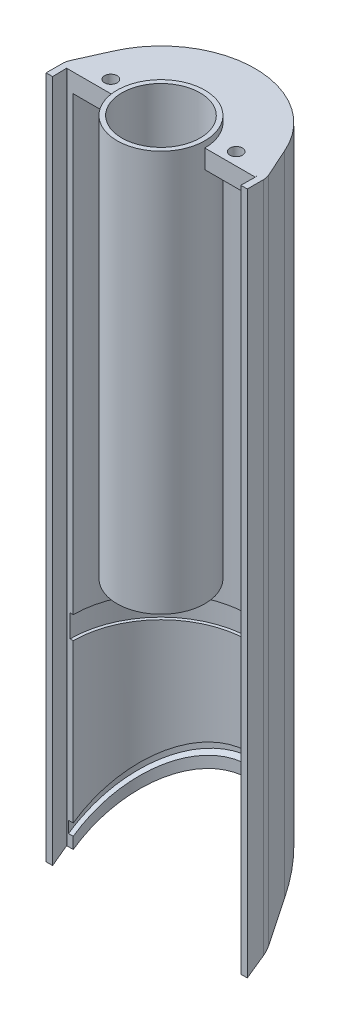
ISO-10303-21;
HEADER;
FILE_DESCRIPTION(('STEP AP214'),'2;1');
FILE_NAME('part.step','',(''),(''),'','','');
FILE_SCHEMA(('AUTOMOTIVE_DESIGN { 1 0 10303 214 1 1 1 1 }'));
ENDSEC;
DATA;
#1=APPLICATION_CONTEXT('core data for automotive mechanical design processes');
#2=APPLICATION_PROTOCOL_DEFINITION('international standard','automotive_design',2000,#1);
#3=PRODUCT_CONTEXT('',#1,'mechanical');
#4=PRODUCT('Part','Part','',(#3));
#5=PRODUCT_RELATED_PRODUCT_CATEGORY('part','',(#4));
#6=PRODUCT_DEFINITION_FORMATION('','',#4);
#7=PRODUCT_DEFINITION_CONTEXT('part definition',#1,'design');
#8=PRODUCT_DEFINITION('design','',#6,#7);
#9=PRODUCT_DEFINITION_SHAPE('','',#8);
#10=(LENGTH_UNIT() NAMED_UNIT(*) SI_UNIT(.MILLI.,.METRE.));
#11=(NAMED_UNIT(*) PLANE_ANGLE_UNIT() SI_UNIT($,.RADIAN.));
#12=(NAMED_UNIT(*) SI_UNIT($,.STERADIAN.) SOLID_ANGLE_UNIT());
#13=UNCERTAINTY_MEASURE_WITH_UNIT(LENGTH_MEASURE(1.E-05),#10,'distance_accuracy_value','');
#14=(GEOMETRIC_REPRESENTATION_CONTEXT(3) GLOBAL_UNCERTAINTY_ASSIGNED_CONTEXT((#13)) GLOBAL_UNIT_ASSIGNED_CONTEXT((#10,
#11,#12)) REPRESENTATION_CONTEXT('',''));
#15=CARTESIAN_POINT('',(0.,0.,0.));
#16=DIRECTION('',(0.,0.,1.));
#17=DIRECTION('',(1.,0.,0.));
#18=AXIS2_PLACEMENT_3D('',#15,#16,#17);
#19=CARTESIAN_POINT('',(49.6684249274681,0.,1.73416378763986E-13));
#20=DIRECTION('',(0.,0.,-1.));
#21=DIRECTION('',(-1.,0.,0.));
#22=AXIS2_PLACEMENT_3D('',#19,#20,#21);
#23=PLANE('',#22);
#24=DIRECTION('',(0.,-1.,0.));
#25=VECTOR('',#24,1.);
#26=CARTESIAN_POINT('',(38.8342124637338,0.,0.));
#27=LINE('',#26,#25);
#28=CARTESIAN_POINT('',(38.834212463734,285.422143483602,0.));
#29=VERTEX_POINT('',#28);
#30=CARTESIAN_POINT('',(38.834212463734,279.422143483602,0.));
#31=VERTEX_POINT('',#30);
#32=EDGE_CURVE('E251',#29,#31,#27,.T.);
#33=ORIENTED_EDGE('',*,*,#32,.T.);
#34=DIRECTION('',(-1.,0.,0.));
#35=VECTOR('',#34,1.);
#36=CARTESIAN_POINT('',(49.6684249274681,279.422143483602,1.73416378763986E-13));
#37=LINE('',#36,#35);
#38=CARTESIAN_POINT('',(52.834212463734,279.422143483602,1.95522954975215E-13));
#39=VERTEX_POINT('',#38);
#40=EDGE_CURVE('E443',#39,#31,#37,.T.);
#41=ORIENTED_EDGE('',*,*,#40,.F.);
#42=DIRECTION('',(0.,1.,0.));
#43=VECTOR('',#42,1.);
#44=CARTESIAN_POINT('',(52.834212463734,0.,1.95522954975215E-13));
#45=LINE('',#44,#43);
#46=CARTESIAN_POINT('',(52.834212463734,135.422143483602,1.95522954975215E-13));
#47=VERTEX_POINT('',#46);
#48=EDGE_CURVE('E439',#47,#39,#45,.T.);
#49=ORIENTED_EDGE('',*,*,#48,.F.);
#50=DIRECTION('',(-1.,0.,0.));
#51=VECTOR('',#50,1.);
#52=CARTESIAN_POINT('',(49.6684249274681,135.422143483602,1.73416378763986E-13));
#53=LINE('',#52,#51);
#54=CARTESIAN_POINT('',(53.834212463734,135.422143483602,2.02505917652902E-13));
#55=VERTEX_POINT('',#54);
#56=EDGE_CURVE('E435',#55,#47,#53,.T.);
#57=ORIENTED_EDGE('',*,*,#56,.F.);
#58=DIRECTION('',(0.,1.,0.));
#59=VECTOR('',#58,1.);
#60=CARTESIAN_POINT('',(53.834212463734,0.,2.02505917652902E-13));
#61=LINE('',#60,#59);
#62=CARTESIAN_POINT('',(53.834212463734,128.22799807346,2.02505917652902E-13));
#63=VERTEX_POINT('',#62);
#64=EDGE_CURVE('E431',#63,#55,#61,.T.);
#65=ORIENTED_EDGE('',*,*,#64,.F.);
#66=DIRECTION('',(1.,0.,0.));
#67=VECTOR('',#66,1.);
#68=CARTESIAN_POINT('',(49.6684249274681,128.22799807346,1.73416378763986E-13));
#69=LINE('',#68,#67);
#70=CARTESIAN_POINT('',(52.834212463734,128.22799807346,1.95522954975215E-13));
#71=VERTEX_POINT('',#70);
#72=EDGE_CURVE('E456',#71,#63,#69,.T.);
#73=ORIENTED_EDGE('',*,*,#72,.F.);
#74=CARTESIAN_POINT('',(52.834212463734,77.8177979071085,1.95522954975215E-13));
#75=VERTEX_POINT('',#74);
#76=EDGE_CURVE('E445',#75,#71,#45,.T.);
#77=ORIENTED_EDGE('',*,*,#76,.F.);
#78=DIRECTION('',(-1.,0.,0.));
#79=VECTOR('',#78,1.);
#80=CARTESIAN_POINT('',(49.6684249274681,77.8177979071085,1.73416378763986E-13));
#81=LINE('',#80,#79);
#82=CARTESIAN_POINT('',(54.334212463734,77.8177979071085,2.05997398991744E-13));
#83=VERTEX_POINT('',#82);
#84=EDGE_CURVE('E339',#83,#75,#81,.T.);
#85=ORIENTED_EDGE('',*,*,#84,.F.);
#86=DIRECTION('',(0.,-1.,0.));
#87=VECTOR('',#86,1.);
#88=CARTESIAN_POINT('',(54.334212463734,151.646797604002,2.05997398991745E-13));
#89=LINE('',#88,#87);
#90=CARTESIAN_POINT('',(54.334212463734,74.1554741408241,2.05997398991744E-13));
#91=VERTEX_POINT('',#90);
#92=EDGE_CURVE('E342',#91,#83,#89,.F.);
#93=ORIENTED_EDGE('',*,*,#92,.F.);
#94=DIRECTION('',(1.,0.,0.));
#95=VECTOR('',#94,1.);
#96=CARTESIAN_POINT('',(49.6684249274681,74.1554741408241,1.73416378763986E-13));
#97=LINE('',#96,#95);
#98=CARTESIAN_POINT('',(52.834212463734,74.155474140824,1.95522954975215E-13));
#99=VERTEX_POINT('',#98);
#100=EDGE_CURVE('E332',#99,#91,#97,.T.);
#101=ORIENTED_EDGE('',*,*,#100,.F.);
#102=CARTESIAN_POINT('',(52.834212463734,70.4931503745398,1.95522954975215E-13));
#103=VERTEX_POINT('',#102);
#104=EDGE_CURVE('E444',#103,#99,#45,.T.);
#105=ORIENTED_EDGE('',*,*,#104,.F.);
#106=DIRECTION('',(1.,0.,0.));
#107=VECTOR('',#106,1.);
#108=CARTESIAN_POINT('',(49.6684249274681,70.4931503745398,1.73416378763986E-13));
#109=LINE('',#108,#107);
#110=CARTESIAN_POINT('',(54.834212463734,70.4931503745397,2.09488880330588E-13));
#111=VERTEX_POINT('',#110);
#112=EDGE_CURVE('E315',#103,#111,#109,.T.);
#113=ORIENTED_EDGE('',*,*,#112,.T.);
#114=DIRECTION('',(0.,-1.,0.));
#115=VECTOR('',#114,1.);
#116=CARTESIAN_POINT('',(54.834212463734,0.,2.09488880330588E-13));
#117=LINE('',#116,#115);
#118=CARTESIAN_POINT('',(54.834212463734,285.422143483602,2.09488880330588E-13));
#119=VERTEX_POINT('',#118);
#120=EDGE_CURVE('E452',#119,#111,#117,.T.);
#121=ORIENTED_EDGE('',*,*,#120,.F.);
#122=DIRECTION('',(1.,0.,0.));
#123=VECTOR('',#122,1.);
#124=CARTESIAN_POINT('',(49.6684249274681,285.422143483602,1.73416378763986E-13));
#125=LINE('',#124,#123);
#126=EDGE_CURVE('E449',#29,#119,#125,.T.);
#127=ORIENTED_EDGE('',*,*,#126,.F.);
#128=EDGE_LOOP('',(#33,#41,#49,#57,#65,#73,#77,#85,#93,#101,#105,#113,#121,#127));
#129=FACE_BOUND('',#128,.T.);
#130=ADVANCED_FACE('F41',(#129),#23,.F.);
#131=CARTESIAN_POINT('',(0.,0.,0.));
#132=DIRECTION('',(0.,0.,1.));
#133=DIRECTION('',(1.,0.,0.));
#134=AXIS2_PLACEMENT_3D('',#131,#132,#133);
#135=PLANE('',#134);
#136=DIRECTION('',(1.,0.,0.));
#137=VECTOR('',#136,1.);
#138=CARTESIAN_POINT('',(0.,279.422143483602,0.));
#139=LINE('',#138,#137);
#140=CARTESIAN_POINT('',(-3.16578753626592,279.422143483602,0.));
#141=VERTEX_POINT('',#140);
#142=CARTESIAN_POINT('',(10.8342124637341,279.422143483602,0.));
#143=VERTEX_POINT('',#142);
#144=EDGE_CURVE('E243',#141,#143,#139,.T.);
#145=ORIENTED_EDGE('',*,*,#144,.T.);
#146=DIRECTION('',(0.,-1.,0.));
#147=VECTOR('',#146,1.);
#148=CARTESIAN_POINT('',(10.8342124637343,0.,0.));
#149=LINE('',#148,#147);
#150=CARTESIAN_POINT('',(10.834212463734,285.422143483602,0.));
#151=VERTEX_POINT('',#150);
#152=EDGE_CURVE('E250',#151,#143,#149,.T.);
#153=ORIENTED_EDGE('',*,*,#152,.F.);
#154=DIRECTION('',(-1.,0.,0.));
#155=VECTOR('',#154,1.);
#156=CARTESIAN_POINT('',(0.,285.422143483602,0.));
#157=LINE('',#156,#155);
#158=CARTESIAN_POINT('',(-5.16578753626595,285.422143483602,0.));
#159=VERTEX_POINT('',#158);
#160=EDGE_CURVE('E227',#151,#159,#157,.T.);
#161=ORIENTED_EDGE('',*,*,#160,.T.);
#162=DIRECTION('',(0.,-1.,0.));
#163=VECTOR('',#162,1.);
#164=CARTESIAN_POINT('',(-5.16578753626595,0.,0.));
#165=LINE('',#164,#163);
#166=CARTESIAN_POINT('',(-5.16578753626595,70.4931503745396,0.));
#167=VERTEX_POINT('',#166);
#168=EDGE_CURVE('E242',#159,#167,#165,.T.);
#169=ORIENTED_EDGE('',*,*,#168,.T.);
#170=DIRECTION('',(-1.,0.,0.));
#171=VECTOR('',#170,1.);
#172=CARTESIAN_POINT('',(-2.98802920582873E-13,70.4931503745397,0.));
#173=LINE('',#172,#171);
#174=CARTESIAN_POINT('',(-3.16578753626595,70.4931503745397,0.));
#175=VERTEX_POINT('',#174);
#176=EDGE_CURVE('E312',#175,#167,#173,.T.);
#177=ORIENTED_EDGE('',*,*,#176,.F.);
#178=DIRECTION('',(0.,1.,0.));
#179=VECTOR('',#178,1.);
#180=CARTESIAN_POINT('',(-3.16578753626596,0.,0.));
#181=LINE('',#180,#179);
#182=CARTESIAN_POINT('',(-3.16578753626595,74.155474140824,0.));
#183=VERTEX_POINT('',#182);
#184=EDGE_CURVE('E421',#175,#183,#181,.T.);
#185=ORIENTED_EDGE('',*,*,#184,.T.);
#186=DIRECTION('',(-1.,0.,0.));
#187=VECTOR('',#186,1.);
#188=CARTESIAN_POINT('',(-3.12826128264873E-13,74.155474140824,0.));
#189=LINE('',#188,#187);
#190=CARTESIAN_POINT('',(-4.66578753626599,74.155474140824,0.));
#191=VERTEX_POINT('',#190);
#192=EDGE_CURVE('E521',#183,#191,#189,.T.);
#193=ORIENTED_EDGE('',*,*,#192,.T.);
#194=DIRECTION('',(0.,-1.,0.));
#195=VECTOR('',#194,1.);
#196=CARTESIAN_POINT('',(-4.66578753626593,151.646797604002,0.));
#197=LINE('',#196,#195);
#198=CARTESIAN_POINT('',(-4.66578753626598,77.8177979071084,0.));
#199=VERTEX_POINT('',#198);
#200=EDGE_CURVE('E525',#191,#199,#197,.F.);
#201=ORIENTED_EDGE('',*,*,#200,.T.);
#202=DIRECTION('',(1.,0.,0.));
#203=VECTOR('',#202,1.);
#204=CARTESIAN_POINT('',(-3.28275703330411E-13,77.8177979071084,0.));
#205=LINE('',#204,#203);
#206=CARTESIAN_POINT('',(-3.16578753626595,77.8177979071084,0.));
#207=VERTEX_POINT('',#206);
#208=EDGE_CURVE('E50',#199,#207,#205,.T.);
#209=ORIENTED_EDGE('',*,*,#208,.T.);
#210=CARTESIAN_POINT('',(-3.16578753626594,128.22799807346,0.));
#211=VERTEX_POINT('',#210);
#212=EDGE_CURVE('E422',#207,#211,#181,.T.);
#213=ORIENTED_EDGE('',*,*,#212,.T.);
#214=DIRECTION('',(-1.,0.,0.));
#215=VECTOR('',#214,1.);
#216=CARTESIAN_POINT('',(0.,128.22799807346,0.));
#217=LINE('',#216,#215);
#218=CARTESIAN_POINT('',(-4.16578753626595,128.22799807346,0.));
#219=VERTEX_POINT('',#218);
#220=EDGE_CURVE('E427',#211,#219,#217,.T.);
#221=ORIENTED_EDGE('',*,*,#220,.T.);
#222=DIRECTION('',(0.,1.,0.));
#223=VECTOR('',#222,1.);
#224=CARTESIAN_POINT('',(-4.16578753626595,0.,0.));
#225=LINE('',#224,#223);
#226=CARTESIAN_POINT('',(-4.16578753626595,135.422143483602,0.));
#227=VERTEX_POINT('',#226);
#228=EDGE_CURVE('E410',#219,#227,#225,.T.);
#229=ORIENTED_EDGE('',*,*,#228,.T.);
#230=DIRECTION('',(1.,0.,0.));
#231=VECTOR('',#230,1.);
#232=CARTESIAN_POINT('',(0.,135.422143483602,0.));
#233=LINE('',#232,#231);
#234=CARTESIAN_POINT('',(-3.16578753626594,135.422143483602,0.));
#235=VERTEX_POINT('',#234);
#236=EDGE_CURVE('E414',#227,#235,#233,.T.);
#237=ORIENTED_EDGE('',*,*,#236,.T.);
#238=EDGE_CURVE('E418',#235,#141,#181,.T.);
#239=ORIENTED_EDGE('',*,*,#238,.T.);
#240=EDGE_LOOP('',(#145,#153,#161,#169,#177,#185,#193,#201,#209,#213,#221,#229,#237,#239));
#241=FACE_BOUND('',#240,.T.);
#242=ADVANCED_FACE('F257',(#241),#135,.T.);
#243=CARTESIAN_POINT('',(24.834212463734,148.471380654833,0.));
#244=DIRECTION('',(0.,1.,0.));
#245=DIRECTION('',(0.,0.,1.));
#246=AXIS2_PLACEMENT_3D('',#243,#244,#245);
#247=CYLINDRICAL_SURFACE('',#246,30.);
#248=CARTESIAN_POINT('',(24.834212463734,70.4931503745398,0.));
#249=DIRECTION('',(0.,0.819152044288988,0.573576436351052));
#250=DIRECTION('',(0.,0.573576436351052,-0.819152044288988));
#251=AXIS2_PLACEMENT_3D('',#248,#249,#250);
#252=ELLIPSE('',#251,36.6232376628439,30.);
#253=CARTESIAN_POINT('',(54.8299339848459,70.8479079016356,-0.506646255198477));
#254=VERTEX_POINT('',#253);
#255=EDGE_CURVE('E281',#254,#111,#252,.F.);
#256=ORIENTED_EDGE('',*,*,#255,.F.);
#257=DIRECTION('',(0.,1.,0.));
#258=VECTOR('',#257,1.);
#259=CARTESIAN_POINT('',(54.8299339848459,148.471380654833,-0.506646255198421));
#260=LINE('',#259,#258);
#261=CARTESIAN_POINT('',(54.8299339848459,285.422143483602,-0.506646255198476));
#262=VERTEX_POINT('',#261);
#263=EDGE_CURVE('E498',#254,#262,#260,.T.);
#264=ORIENTED_EDGE('',*,*,#263,.T.);
#265=CARTESIAN_POINT('',(24.834212463734,285.422143483602,0.));
#266=DIRECTION('',(0.,1.,0.));
#267=DIRECTION('',(0.,0.,1.));
#268=AXIS2_PLACEMENT_3D('',#265,#266,#267);
#269=CIRCLE('',#268,30.);
#270=EDGE_CURVE('E254',#119,#262,#269,.T.);
#271=ORIENTED_EDGE('',*,*,#270,.F.);
#272=ORIENTED_EDGE('',*,*,#120,.T.);
#273=EDGE_LOOP('',(#256,#264,#271,#272));
#274=FACE_BOUND('',#273,.T.);
#275=ADVANCED_FACE('F576',(#274),#247,.T.);
#276=CARTESIAN_POINT('',(-5.16150905737781,70.8479079016354,-0.506646255198522));
#277=VERTEX_POINT('',#276);
#278=EDGE_CURVE('E282',#167,#277,#252,.F.);
#279=ORIENTED_EDGE('',*,*,#278,.F.);
#280=ORIENTED_EDGE('',*,*,#168,.F.);
#281=CARTESIAN_POINT('',(-5.16150905737782,285.422143483602,-0.506646255198524));
#282=VERTEX_POINT('',#281);
#283=EDGE_CURVE('E236',#282,#159,#269,.T.);
#284=ORIENTED_EDGE('',*,*,#283,.F.);
#285=DIRECTION('',(0.,1.,0.));
#286=VECTOR('',#285,1.);
#287=CARTESIAN_POINT('',(-5.16150905737782,148.471380654833,-0.506646255198421));
#288=LINE('',#287,#286);
#289=EDGE_CURVE('E375',#277,#282,#288,.T.);
#290=ORIENTED_EDGE('',*,*,#289,.F.);
#291=EDGE_LOOP('',(#279,#280,#284,#290));
#292=FACE_BOUND('',#291,.T.);
#293=ADVANCED_FACE('F637',(#292),#247,.T.);
#294=CARTESIAN_POINT('',(24.834212463734,148.471380654833,0.));
#295=DIRECTION('',(0.,1.,0.));
#296=DIRECTION('',(0.,0.,1.));
#297=AXIS2_PLACEMENT_3D('',#294,#295,#296);
#298=CYLINDRICAL_SURFACE('',#297,28.);
#299=ORIENTED_EDGE('',*,*,#212,.F.);
#300=CARTESIAN_POINT('',(24.834212463734,77.8177979071085,0.));
#301=DIRECTION('',(0.,-0.819152044288989,-0.57357643635105));
#302=DIRECTION('',(0.,0.57357643635105,-0.819152044288989));
#303=AXIS2_PLACEMENT_3D('',#300,#301,#302);
#304=ELLIPSE('',#303,34.1816884853209,28.);
#305=EDGE_CURVE('E335',#207,#75,#304,.T.);
#306=ORIENTED_EDGE('',*,*,#305,.T.);
#307=ORIENTED_EDGE('',*,*,#76,.T.);
#308=CARTESIAN_POINT('',(24.834212463734,128.22799807346,0.));
#309=DIRECTION('',(0.,1.,0.));
#310=DIRECTION('',(0.,0.,1.));
#311=AXIS2_PLACEMENT_3D('',#308,#309,#310);
#312=CIRCLE('',#311,28.);
#313=EDGE_CURVE('E463',#71,#211,#312,.T.);
#314=ORIENTED_EDGE('',*,*,#313,.T.);
#315=EDGE_LOOP('',(#299,#306,#307,#314));
#316=FACE_BOUND('',#315,.T.);
#317=ADVANCED_FACE('F534',(#316),#298,.F.);
#318=CARTESIAN_POINT('',(24.834212463734,70.4931503745398,0.));
#319=DIRECTION('',(0.,0.819152044288988,0.573576436351052));
#320=DIRECTION('',(0.,0.573576436351052,-0.819152044288988));
#321=AXIS2_PLACEMENT_3D('',#318,#319,#320);
#322=ELLIPSE('',#321,34.1816884853209,28.);
#323=EDGE_CURVE('E319',#103,#175,#322,.T.);
#324=ORIENTED_EDGE('',*,*,#323,.F.);
#325=ORIENTED_EDGE('',*,*,#104,.T.);
#326=CARTESIAN_POINT('',(24.834212463734,74.1554741408241,0.));
#327=DIRECTION('',(0.,0.819152044288989,0.57357643635105));
#328=DIRECTION('',(0.,0.57357643635105,-0.819152044288989));
#329=AXIS2_PLACEMENT_3D('',#326,#327,#328);
#330=ELLIPSE('',#329,34.1816884853209,28.);
#331=EDGE_CURVE('E328',#99,#183,#330,.T.);
#332=ORIENTED_EDGE('',*,*,#331,.T.);
#333=ORIENTED_EDGE('',*,*,#184,.F.);
#334=EDGE_LOOP('',(#324,#325,#332,#333));
#335=FACE_BOUND('',#334,.T.);
#336=ADVANCED_FACE('F547',(#335),#298,.F.);
#337=CARTESIAN_POINT('',(-2.68165119036083,78.8628200722244,-11.9531270958382));
#338=VERTEX_POINT('',#337);
#339=CARTESIAN_POINT('',(52.3500761178289,78.8628200722246,-11.9531270958382));
#340=VERTEX_POINT('',#339);
#341=EDGE_CURVE('E277',#338,#340,#252,.F.);
#342=ORIENTED_EDGE('',*,*,#341,.F.);
#343=DIRECTION('',(0.,1.,0.));
#344=VECTOR('',#343,1.);
#345=CARTESIAN_POINT('',(-2.68165119036083,54.9221434836021,-11.9531270958382));
#346=LINE('',#345,#344);
#347=CARTESIAN_POINT('',(-2.68165119036083,285.422143483602,-11.9531270958382));
#348=VERTEX_POINT('',#347);
#349=EDGE_CURVE('E346',#338,#348,#346,.T.);
#350=ORIENTED_EDGE('',*,*,#349,.T.);
#351=CARTESIAN_POINT('',(52.3500761178288,285.422143483602,-11.9531270958384));
#352=VERTEX_POINT('',#351);
#353=EDGE_CURVE('E469',#352,#348,#269,.T.);
#354=ORIENTED_EDGE('',*,*,#353,.F.);
#355=DIRECTION('',(0.,1.,0.));
#356=VECTOR('',#355,1.);
#357=CARTESIAN_POINT('',(52.3500761178289,54.9221434836021,-11.9531270958382));
#358=LINE('',#357,#356);
#359=EDGE_CURVE('E407',#340,#352,#358,.T.);
#360=ORIENTED_EDGE('',*,*,#359,.F.);
#361=EDGE_LOOP('',(#342,#350,#354,#360));
#362=FACE_BOUND('',#361,.T.);
#363=ADVANCED_FACE('F603',(#362),#247,.T.);
#364=CARTESIAN_POINT('',(24.834212463734,148.471380654833,0.));
#365=DIRECTION('',(0.,1.,0.));
#366=DIRECTION('',(0.,0.,1.));
#367=AXIS2_PLACEMENT_3D('',#364,#365,#366);
#368=CYLINDRICAL_SURFACE('',#367,29.);
#369=CARTESIAN_POINT('',(24.834212463734,135.422143483602,0.));
#370=DIRECTION('',(0.,1.,0.));
#371=DIRECTION('',(0.,0.,1.));
#372=AXIS2_PLACEMENT_3D('',#369,#370,#371);
#373=CIRCLE('',#372,29.);
#374=EDGE_CURVE('E495',#55,#227,#373,.T.);
#375=ORIENTED_EDGE('',*,*,#374,.T.);
#376=ORIENTED_EDGE('',*,*,#228,.F.);
#377=CARTESIAN_POINT('',(24.834212463734,128.22799807346,0.));
#378=DIRECTION('',(0.,1.,0.));
#379=DIRECTION('',(0.,0.,1.));
#380=AXIS2_PLACEMENT_3D('',#377,#378,#379);
#381=CIRCLE('',#380,29.);
#382=EDGE_CURVE('E460',#63,#219,#381,.T.);
#383=ORIENTED_EDGE('',*,*,#382,.F.);
#384=ORIENTED_EDGE('',*,*,#64,.T.);
#385=EDGE_LOOP('',(#375,#376,#383,#384));
#386=FACE_BOUND('',#385,.T.);
#387=ADVANCED_FACE('F560',(#386),#368,.F.);
#388=CARTESIAN_POINT('',(49.6684249274681,135.422143483602,1.73416378763986E-13));
#389=DIRECTION('',(0.,-1.,0.));
#390=DIRECTION('',(0.,0.,-1.));
#391=AXIS2_PLACEMENT_3D('',#388,#389,#390);
#392=PLANE('',#391);
#393=CARTESIAN_POINT('',(24.834212463734,135.422143483602,0.));
#394=DIRECTION('',(0.,1.,0.));
#395=DIRECTION('',(0.,0.,1.));
#396=AXIS2_PLACEMENT_3D('',#393,#394,#395);
#397=CIRCLE('',#396,28.);
#398=EDGE_CURVE('E492',#47,#235,#397,.T.);
#399=ORIENTED_EDGE('',*,*,#398,.T.);
#400=ORIENTED_EDGE('',*,*,#236,.F.);
#401=ORIENTED_EDGE('',*,*,#374,.F.);
#402=ORIENTED_EDGE('',*,*,#56,.T.);
#403=EDGE_LOOP('',(#399,#400,#401,#402));
#404=FACE_BOUND('',#403,.T.);
#405=ADVANCED_FACE('F565',(#404),#392,.T.);
#406=CARTESIAN_POINT('',(24.834212463734,279.422143483602,0.));
#407=DIRECTION('',(0.,1.,0.));
#408=DIRECTION('',(0.,0.,1.));
#409=AXIS2_PLACEMENT_3D('',#406,#407,#408);
#410=CIRCLE('',#409,28.);
#411=EDGE_CURVE('E489',#39,#141,#410,.T.);
#412=ORIENTED_EDGE('',*,*,#411,.T.);
#413=ORIENTED_EDGE('',*,*,#238,.F.);
#414=ORIENTED_EDGE('',*,*,#398,.F.);
#415=ORIENTED_EDGE('',*,*,#48,.T.);
#416=EDGE_LOOP('',(#412,#413,#414,#415));
#417=FACE_BOUND('',#416,.T.);
#418=ADVANCED_FACE('F567',(#417),#298,.F.);
#419=CARTESIAN_POINT('',(49.6684249274681,279.422143483602,1.73416378763986E-13));
#420=DIRECTION('',(0.,-1.,0.));
#421=DIRECTION('',(0.,0.,-1.));
#422=AXIS2_PLACEMENT_3D('',#419,#420,#421);
#423=PLANE('',#422);
#424=CARTESIAN_POINT('',(4.83421246373404,279.422143483602,-4.));
#425=DIRECTION('',(0.,-1.,0.));
#426=DIRECTION('',(0.,0.,-1.));
#427=AXIS2_PLACEMENT_3D('',#424,#425,#426);
#428=CIRCLE('',#427,2.);
#429=CARTESIAN_POINT('',(4.83421246373404,279.422143483602,-6.));
#430=VERTEX_POINT('',#429);
#431=EDGE_CURVE('E261',#430,#430,#428,.T.);
#432=ORIENTED_EDGE('',*,*,#431,.F.);
#433=EDGE_LOOP('',(#432));
#434=FACE_BOUND('',#433,.T.);
#435=CARTESIAN_POINT('',(44.834212463734,279.422143483602,-4.));
#436=DIRECTION('',(0.,-1.,0.));
#437=DIRECTION('',(0.,0.,-1.));
#438=AXIS2_PLACEMENT_3D('',#435,#436,#437);
#439=CIRCLE('',#438,2.);
#440=CARTESIAN_POINT('',(44.834212463734,279.422143483602,-6.));
#441=VERTEX_POINT('',#440);
#442=EDGE_CURVE('E268',#441,#441,#439,.T.);
#443=ORIENTED_EDGE('',*,*,#442,.F.);
#444=EDGE_LOOP('',(#443));
#445=FACE_BOUND('',#444,.T.);
#446=CARTESIAN_POINT('',(24.834212463734,279.422143483602,0.));
#447=DIRECTION('',(0.,1.,0.));
#448=DIRECTION('',(0.,0.,1.));
#449=AXIS2_PLACEMENT_3D('',#446,#447,#448);
#450=CIRCLE('',#449,14.);
#451=EDGE_CURVE('E486',#31,#143,#450,.T.);
#452=ORIENTED_EDGE('',*,*,#451,.T.);
#453=ORIENTED_EDGE('',*,*,#144,.F.);
#454=ORIENTED_EDGE('',*,*,#411,.F.);
#455=ORIENTED_EDGE('',*,*,#40,.T.);
#456=EDGE_LOOP('',(#452,#453,#454,#455));
#457=FACE_BOUND('',#456,.T.);
#458=ADVANCED_FACE('F570',(#434,#445,#457),#423,.T.);
#459=CARTESIAN_POINT('',(49.6684249274681,159.422143483602,1.73416378763986E-13));
#460=DIRECTION('',(0.,-1.,0.));
#461=DIRECTION('',(0.,0.,-1.));
#462=AXIS2_PLACEMENT_3D('',#459,#460,#461);
#463=PLANE('',#462);
#464=CARTESIAN_POINT('',(24.834212463734,159.422143483602,0.));
#465=DIRECTION('',(0.,1.,0.));
#466=DIRECTION('',(0.,0.,1.));
#467=AXIS2_PLACEMENT_3D('',#464,#465,#466);
#468=CIRCLE('',#467,12.5);
#469=CARTESIAN_POINT('',(24.834212463734,159.422143483602,12.5));
#470=VERTEX_POINT('',#469);
#471=EDGE_CURVE('E478',#470,#470,#468,.T.);
#472=ORIENTED_EDGE('',*,*,#471,.T.);
#473=EDGE_LOOP('',(#472));
#474=FACE_BOUND('',#473,.T.);
#475=CARTESIAN_POINT('',(24.834212463734,159.422143483602,0.));
#476=DIRECTION('',(0.,1.,0.));
#477=DIRECTION('',(0.,0.,1.));
#478=AXIS2_PLACEMENT_3D('',#475,#476,#477);
#479=CIRCLE('',#478,14.);
#480=CARTESIAN_POINT('',(24.834212463734,159.422143483602,14.));
#481=VERTEX_POINT('',#480);
#482=EDGE_CURVE('E482',#481,#481,#479,.T.);
#483=ORIENTED_EDGE('',*,*,#482,.F.);
#484=EDGE_LOOP('',(#483));
#485=FACE_BOUND('',#484,.T.);
#486=ADVANCED_FACE('F683',(#474,#485),#463,.T.);
#487=CARTESIAN_POINT('',(24.834212463734,148.471380654833,0.));
#488=DIRECTION('',(0.,1.,0.));
#489=DIRECTION('',(0.,0.,1.));
#490=AXIS2_PLACEMENT_3D('',#487,#488,#489);
#491=CYLINDRICAL_SURFACE('',#490,12.5);
#492=ORIENTED_EDGE('',*,*,#471,.F.);
#493=EDGE_LOOP('',(#492));
#494=FACE_BOUND('',#493,.T.);
#495=CARTESIAN_POINT('',(24.834212463734,287.422143483602,0.));
#496=DIRECTION('',(0.,1.,0.));
#497=DIRECTION('',(0.,0.,1.));
#498=AXIS2_PLACEMENT_3D('',#495,#496,#497);
#499=CIRCLE('',#498,12.5);
#500=CARTESIAN_POINT('',(24.834212463734,287.422143483602,12.5));
#501=VERTEX_POINT('',#500);
#502=EDGE_CURVE('E474',#501,#501,#499,.T.);
#503=ORIENTED_EDGE('',*,*,#502,.T.);
#504=EDGE_LOOP('',(#503));
#505=FACE_BOUND('',#504,.T.);
#506=ADVANCED_FACE('F679',(#494,#505),#491,.F.);
#507=CARTESIAN_POINT('',(49.6684249274681,287.422143483602,1.73416378763986E-13));
#508=DIRECTION('',(0.,1.,0.));
#509=DIRECTION('',(0.,0.,1.));
#510=AXIS2_PLACEMENT_3D('',#507,#508,#509);
#511=PLANE('',#510);
#512=CARTESIAN_POINT('',(24.834212463734,287.422143483602,0.));
#513=DIRECTION('',(0.,1.,0.));
#514=DIRECTION('',(0.,0.,1.));
#515=AXIS2_PLACEMENT_3D('',#512,#513,#514);
#516=CIRCLE('',#515,14.);
#517=CARTESIAN_POINT('',(24.834212463734,287.422143483602,14.));
#518=VERTEX_POINT('',#517);
#519=EDGE_CURVE('E253',#518,#518,#516,.T.);
#520=ORIENTED_EDGE('',*,*,#519,.T.);
#521=EDGE_LOOP('',(#520));
#522=FACE_BOUND('',#521,.T.);
#523=ORIENTED_EDGE('',*,*,#502,.F.);
#524=EDGE_LOOP('',(#523));
#525=FACE_BOUND('',#524,.T.);
#526=ADVANCED_FACE('F675',(#522,#525),#511,.T.);
#527=CARTESIAN_POINT('',(24.834212463734,148.471380654833,0.));
#528=DIRECTION('',(0.,1.,0.));
#529=DIRECTION('',(0.,0.,1.));
#530=AXIS2_PLACEMENT_3D('',#527,#528,#529);
#531=CYLINDRICAL_SURFACE('',#530,14.);
#532=ORIENTED_EDGE('',*,*,#482,.T.);
#533=EDGE_LOOP('',(#532));
#534=FACE_BOUND('',#533,.T.);
#535=ORIENTED_EDGE('',*,*,#32,.F.);
#536=CARTESIAN_POINT('',(24.834212463734,285.422143483602,0.));
#537=DIRECTION('',(0.,1.,0.));
#538=DIRECTION('',(0.,0.,1.));
#539=AXIS2_PLACEMENT_3D('',#536,#537,#538);
#540=CIRCLE('',#539,14.);
#541=EDGE_CURVE('E232',#29,#151,#540,.T.);
#542=ORIENTED_EDGE('',*,*,#541,.T.);
#543=ORIENTED_EDGE('',*,*,#152,.T.);
#544=ORIENTED_EDGE('',*,*,#451,.F.);
#545=EDGE_LOOP('',(#535,#542,#543,#544));
#546=FACE_BOUND('',#545,.T.);
#547=ORIENTED_EDGE('',*,*,#519,.F.);
#548=EDGE_LOOP('',(#547));
#549=FACE_BOUND('',#548,.T.);
#550=ADVANCED_FACE('F247',(#534,#546,#549),#531,.T.);
#551=CARTESIAN_POINT('',(49.6684249274681,285.422143483602,1.73416378763986E-13));
#552=DIRECTION('',(0.,1.,0.));
#553=DIRECTION('',(0.,0.,1.));
#554=AXIS2_PLACEMENT_3D('',#551,#552,#553);
#555=PLANE('',#554);
#556=CARTESIAN_POINT('',(4.83421246373404,285.422143483602,-4.));
#557=DIRECTION('',(0.,1.,0.));
#558=DIRECTION('',(0.,0.,1.));
#559=AXIS2_PLACEMENT_3D('',#556,#557,#558);
#560=CIRCLE('',#559,2.);
#561=CARTESIAN_POINT('',(4.83421246373404,285.422143483602,-2.));
#562=VERTEX_POINT('',#561);
#563=EDGE_CURVE('E861',#562,#562,#560,.T.);
#564=ORIENTED_EDGE('',*,*,#563,.F.);
#565=EDGE_LOOP('',(#564));
#566=FACE_BOUND('',#565,.T.);
#567=CARTESIAN_POINT('',(44.834212463734,285.422143483602,-4.));
#568=DIRECTION('',(0.,1.,0.));
#569=DIRECTION('',(0.,0.,1.));
#570=AXIS2_PLACEMENT_3D('',#567,#568,#569);
#571=CIRCLE('',#570,2.);
#572=CARTESIAN_POINT('',(44.834212463734,285.422143483602,-2.));
#573=VERTEX_POINT('',#572);
#574=EDGE_CURVE('E863',#573,#573,#571,.T.);
#575=ORIENTED_EDGE('',*,*,#574,.F.);
#576=EDGE_LOOP('',(#575));
#577=FACE_BOUND('',#576,.T.);
#578=DIRECTION('',(-0.40888317600406,0.,0.912586734716669));
#579=VECTOR('',#578,1.);
#580=CARTESIAN_POINT('',(-2.68165119036083,285.422143483602,-11.9531270958382));
#581=LINE('',#580,#579);
#582=CARTESIAN_POINT('',(-6.8329265736895,285.422143483602,-2.68789176870899));
#583=VERTEX_POINT('',#582);
#584=EDGE_CURVE('E369',#348,#583,#581,.T.);
#585=ORIENTED_EDGE('',*,*,#584,.T.);
#586=CARTESIAN_POINT('',(-2.26999290010615,285.422143483602,-0.643475888688691));
#587=DIRECTION('',(0.,1.,0.));
#588=DIRECTION('',(0.,0.,1.));
#589=AXIS2_PLACEMENT_3D('',#586,#587,#588);
#590=CIRCLE('',#589,5.);
#591=CARTESIAN_POINT('',(-7.26999290010615,285.422143483602,-0.643475888688691));
#592=VERTEX_POINT('',#591);
#593=EDGE_CURVE('E507',#583,#592,#590,.T.);
#594=ORIENTED_EDGE('',*,*,#593,.T.);
#595=DIRECTION('',(0.,0.,1.));
#596=VECTOR('',#595,1.);
#597=CARTESIAN_POINT('',(-7.26999290010615,285.422143483602,-1.71240303479439));
#598=LINE('',#597,#596);
#599=CARTESIAN_POINT('',(-7.26999290010615,285.422143483602,4.54929625370771));
#600=VERTEX_POINT('',#599);
#601=EDGE_CURVE('E365',#592,#600,#598,.T.);
#602=ORIENTED_EDGE('',*,*,#601,.T.);
#603=DIRECTION('',(1.,0.,0.));
#604=VECTOR('',#603,1.);
#605=CARTESIAN_POINT('',(-7.26999290010615,285.422143483602,4.54929625370771));
#606=LINE('',#605,#604);
#607=CARTESIAN_POINT('',(-5.20676034624559,285.422143483602,4.54929625370771));
#608=VERTEX_POINT('',#607);
#609=EDGE_CURVE('E361',#600,#608,#606,.T.);
#610=ORIENTED_EDGE('',*,*,#609,.T.);
#611=DIRECTION('',(-0.0141793697716953,0.,-0.999899467683065));
#612=VECTOR('',#611,1.);
#613=CARTESIAN_POINT('',(-5.20676034624559,285.422143483602,4.54929625370771));
#614=LINE('',#613,#612);
#615=CARTESIAN_POINT('',(-5.27127298563292,285.422143483602,6.74287015112185E-12));
#616=VERTEX_POINT('',#615);
#617=EDGE_CURVE('E349',#608,#616,#614,.T.);
#618=ORIENTED_EDGE('',*,*,#617,.T.);
#619=DIRECTION('',(0.211735977497008,0.,-0.977326903258775));
#620=VECTOR('',#619,1.);
#621=CARTESIAN_POINT('',(-5.27127298563292,285.422143483602,6.74287015112185E-12));
#622=LINE('',#621,#620);
#623=EDGE_CURVE('E372',#616,#282,#622,.T.);
#624=ORIENTED_EDGE('',*,*,#623,.T.);
#625=ORIENTED_EDGE('',*,*,#283,.T.);
#626=ORIENTED_EDGE('',*,*,#160,.F.);
#627=ORIENTED_EDGE('',*,*,#541,.F.);
#628=ORIENTED_EDGE('',*,*,#126,.T.);
#629=ORIENTED_EDGE('',*,*,#270,.T.);
#630=DIRECTION('',(-0.211735977497008,0.,-0.977326903258775));
#631=VECTOR('',#630,1.);
#632=CARTESIAN_POINT('',(54.939697913101,285.422143483602,6.74287015112185E-12));
#633=LINE('',#632,#631);
#634=CARTESIAN_POINT('',(54.939697913101,285.422143483602,6.74287015112185E-12));
#635=VERTEX_POINT('',#634);
#636=EDGE_CURVE('E378',#635,#262,#633,.T.);
#637=ORIENTED_EDGE('',*,*,#636,.F.);
#638=DIRECTION('',(0.0141793697716953,0.,-0.999899467683065));
#639=VECTOR('',#638,1.);
#640=CARTESIAN_POINT('',(54.8751852737137,285.422143483602,4.54929625370771));
#641=LINE('',#640,#639);
#642=CARTESIAN_POINT('',(54.8751852737137,285.422143483602,4.54929625370771));
#643=VERTEX_POINT('',#642);
#644=EDGE_CURVE('E394',#643,#635,#641,.T.);
#645=ORIENTED_EDGE('',*,*,#644,.F.);
#646=DIRECTION('',(-1.,0.,0.));
#647=VECTOR('',#646,1.);
#648=CARTESIAN_POINT('',(56.9384178275742,285.422143483602,4.54929625370771));
#649=LINE('',#648,#647);
#650=CARTESIAN_POINT('',(56.9384178275742,285.422143483602,4.54929625370771));
#651=VERTEX_POINT('',#650);
#652=EDGE_CURVE('E390',#651,#643,#649,.T.);
#653=ORIENTED_EDGE('',*,*,#652,.F.);
#654=DIRECTION('',(0.,0.,1.));
#655=VECTOR('',#654,1.);
#656=CARTESIAN_POINT('',(56.9384178275742,285.422143483602,-1.71240303479439));
#657=LINE('',#656,#655);
#658=CARTESIAN_POINT('',(56.9384178275742,285.422143483602,-0.643475888688683));
#659=VERTEX_POINT('',#658);
#660=EDGE_CURVE('E386',#659,#651,#657,.T.);
#661=ORIENTED_EDGE('',*,*,#660,.F.);
#662=CARTESIAN_POINT('',(51.9384178275742,285.422143483602,-0.643475888688683));
#663=DIRECTION('',(0.,1.,0.));
#664=DIRECTION('',(0.,0.,1.));
#665=AXIS2_PLACEMENT_3D('',#662,#663,#664);
#666=CIRCLE('',#665,5.);
#667=CARTESIAN_POINT('',(56.5013515011576,285.422143483602,-2.68789176870898));
#668=VERTEX_POINT('',#667);
#669=EDGE_CURVE('E504',#659,#668,#666,.T.);
#670=ORIENTED_EDGE('',*,*,#669,.T.);
#671=DIRECTION('',(0.40888317600406,0.,0.912586734716669));
#672=VECTOR('',#671,1.);
#673=CARTESIAN_POINT('',(52.3500761178289,285.422143483602,-11.9531270958382));
#674=LINE('',#673,#672);
#675=EDGE_CURVE('E382',#352,#668,#674,.T.);
#676=ORIENTED_EDGE('',*,*,#675,.F.);
#677=ORIENTED_EDGE('',*,*,#353,.T.);
#678=EDGE_LOOP('',(#585,#594,#602,#610,#618,#624,#625,#626,#627,#628,#629,#637,#645,#653,#661,
#670,#676,#677));
#679=FACE_BOUND('',#678,.T.);
#680=ADVANCED_FACE('F230',(#566,#577,#679),#555,.T.);
#681=CARTESIAN_POINT('',(49.6684249274681,128.22799807346,1.73416378763986E-13));
#682=DIRECTION('',(0.,1.,0.));
#683=DIRECTION('',(0.,0.,1.));
#684=AXIS2_PLACEMENT_3D('',#681,#682,#683);
#685=PLANE('',#684);
#686=ORIENTED_EDGE('',*,*,#72,.T.);
#687=ORIENTED_EDGE('',*,*,#382,.T.);
#688=ORIENTED_EDGE('',*,*,#220,.F.);
#689=ORIENTED_EDGE('',*,*,#313,.F.);
#690=EDGE_LOOP('',(#686,#687,#688,#689));
#691=FACE_BOUND('',#690,.T.);
#692=ADVANCED_FACE('F555',(#691),#685,.T.);
#693=CARTESIAN_POINT('',(54.939697913101,54.9221434836021,6.74287015112185E-12));
#694=DIRECTION('',(0.977326903258775,0.,-0.211735977497008));
#695=DIRECTION('',(-0.211735977497008,0.,-0.977326903258775));
#696=AXIS2_PLACEMENT_3D('',#693,#694,#695);
#697=PLANE('',#696);
#698=ORIENTED_EDGE('',*,*,#263,.F.);
#699=DIRECTION('',(0.174737374271751,-0.564752007094701,0.806549453235895));
#700=VECTOR('',#699,1.);
#701=CARTESIAN_POINT('',(56.4762959901358,65.5268582362908,7.09260021813936));
#702=LINE('',#701,#700);
#703=CARTESIAN_POINT('',(54.939697913101,70.4931503745352,6.74287015112185E-12));
#704=VERTEX_POINT('',#703);
#705=EDGE_CURVE('E308',#254,#704,#702,.T.);
#706=ORIENTED_EDGE('',*,*,#705,.T.);
#707=DIRECTION('',(0.,1.,0.));
#708=VECTOR('',#707,1.);
#709=CARTESIAN_POINT('',(54.939697913101,54.9221434836021,6.74287015112185E-12));
#710=LINE('',#709,#708);
#711=EDGE_CURVE('E398',#704,#635,#710,.T.);
#712=ORIENTED_EDGE('',*,*,#711,.T.);
#713=ORIENTED_EDGE('',*,*,#636,.T.);
#714=EDGE_LOOP('',(#698,#706,#712,#713));
#715=FACE_BOUND('',#714,.T.);
#716=ADVANCED_FACE('F579',(#715),#697,.F.);
#717=CARTESIAN_POINT('',(52.3500761178289,54.9221434836021,-11.9531270958382));
#718=DIRECTION('',(-0.912586734716669,0.,0.40888317600406));
#719=DIRECTION('',(0.40888317600406,0.,0.912586734716669));
#720=AXIS2_PLACEMENT_3D('',#717,#718,#719);
#721=PLANE('',#720);
#722=DIRECTION('',(0.,1.,0.));
#723=VECTOR('',#722,1.);
#724=CARTESIAN_POINT('',(56.5013515011576,54.9221434836021,-2.68789176870899));
#725=LINE('',#724,#723);
#726=CARTESIAN_POINT('',(56.5013515011576,72.3752324528818,-2.68789176870899));
#727=VERTEX_POINT('',#726);
#728=EDGE_CURVE('E517',#668,#727,#725,.F.);
#729=ORIENTED_EDGE('',*,*,#728,.T.);
#730=DIRECTION('',(-0.344546935763793,0.538455830639536,-0.768994621246513));
#731=VECTOR('',#730,1.);
#732=CARTESIAN_POINT('',(56.7916295981818,71.9215876294177,-2.04001981830988));
#733=LINE('',#732,#731);
#734=EDGE_CURVE('E56',#727,#340,#733,.T.);
#735=ORIENTED_EDGE('',*,*,#734,.T.);
#736=ORIENTED_EDGE('',*,*,#359,.T.);
#737=ORIENTED_EDGE('',*,*,#675,.T.);
#738=EDGE_LOOP('',(#729,#735,#736,#737));
#739=FACE_BOUND('',#738,.T.);
#740=ADVANCED_FACE('F599',(#739),#721,.F.);
#741=CARTESIAN_POINT('',(56.9384178275742,54.9221434836021,-1.71240303479439));
#742=DIRECTION('',(-1.,0.,0.));
#743=DIRECTION('',(0.,0.,1.));
#744=AXIS2_PLACEMENT_3D('',#741,#742,#743);
#745=PLANE('',#744);
#746=DIRECTION('',(0.,1.,0.));
#747=VECTOR('',#746,1.);
#748=CARTESIAN_POINT('',(56.9384178275742,54.9221434836021,4.54929625370771));
#749=LINE('',#748,#747);
#750=CARTESIAN_POINT('',(56.9384178275742,67.3076988441445,4.54929625370771));
#751=VERTEX_POINT('',#750);
#752=EDGE_CURVE('E404',#751,#651,#749,.T.);
#753=ORIENTED_EDGE('',*,*,#752,.F.);
#754=DIRECTION('',(0.,0.573576436351052,-0.819152044288988));
#755=VECTOR('',#754,1.);
#756=CARTESIAN_POINT('',(56.9384178275742,66.1750121811565,6.1669404537174));
#757=LINE('',#756,#755);
#758=CARTESIAN_POINT('',(56.9384178275742,70.9437170424559,-0.643475888688683));
#759=VERTEX_POINT('',#758);
#760=EDGE_CURVE('E265',#751,#759,#757,.T.);
#761=ORIENTED_EDGE('',*,*,#760,.T.);
#762=DIRECTION('',(0.,1.,0.));
#763=VECTOR('',#762,1.);
#764=CARTESIAN_POINT('',(56.9384178275742,54.9221434836021,-0.643475888688683));
#765=LINE('',#764,#763);
#766=EDGE_CURVE('E514',#759,#659,#765,.T.);
#767=ORIENTED_EDGE('',*,*,#766,.T.);
#768=ORIENTED_EDGE('',*,*,#660,.T.);
#769=EDGE_LOOP('',(#753,#761,#767,#768));
#770=FACE_BOUND('',#769,.T.);
#771=ADVANCED_FACE('F590',(#770),#745,.F.);
#772=CARTESIAN_POINT('',(56.9384178275742,54.9221434836021,4.54929625370771));
#773=DIRECTION('',(0.,0.,-1.));
#774=DIRECTION('',(-1.,0.,0.));
#775=AXIS2_PLACEMENT_3D('',#772,#773,#774);
#776=PLANE('',#775);
#777=DIRECTION('',(0.,1.,0.));
#778=VECTOR('',#777,1.);
#779=CARTESIAN_POINT('',(54.8751852737137,54.9221434836021,4.54929625370771));
#780=LINE('',#779,#778);
#781=CARTESIAN_POINT('',(54.8751852737137,67.3076988441445,4.54929625370771));
#782=VERTEX_POINT('',#781);
#783=EDGE_CURVE('E401',#782,#643,#780,.T.);
#784=ORIENTED_EDGE('',*,*,#783,.F.);
#785=DIRECTION('',(1.,0.,0.));
#786=VECTOR('',#785,1.);
#787=CARTESIAN_POINT('',(56.9384178275742,67.3076988441445,4.54929625370771));
#788=LINE('',#787,#786);
#789=EDGE_CURVE('E285',#782,#751,#788,.T.);
#790=ORIENTED_EDGE('',*,*,#789,.T.);
#791=ORIENTED_EDGE('',*,*,#752,.T.);
#792=ORIENTED_EDGE('',*,*,#652,.T.);
#793=EDGE_LOOP('',(#784,#790,#791,#792));
#794=FACE_BOUND('',#793,.T.);
#795=ADVANCED_FACE('F587',(#794),#776,.F.);
#796=CARTESIAN_POINT('',(54.8751852737137,54.9221434836021,4.54929625370771));
#797=DIRECTION('',(0.999899467683065,0.,0.0141793697716953));
#798=DIRECTION('',(0.0141793697716953,0.,-0.999899467683065));
#799=AXIS2_PLACEMENT_3D('',#796,#797,#798);
#800=PLANE('',#799);
#801=ORIENTED_EDGE('',*,*,#711,.F.);
#802=DIRECTION('',(-0.0116154438928377,-0.573537741999086,0.819096783027355));
#803=VECTOR('',#802,1.);
#804=CARTESIAN_POINT('',(54.7926739986553,63.2335256293247,10.3678186095746));
#805=LINE('',#804,#803);
#806=EDGE_CURVE('E304',#704,#782,#805,.T.);
#807=ORIENTED_EDGE('',*,*,#806,.T.);
#808=ORIENTED_EDGE('',*,*,#783,.T.);
#809=ORIENTED_EDGE('',*,*,#644,.T.);
#810=EDGE_LOOP('',(#801,#807,#808,#809));
#811=FACE_BOUND('',#810,.T.);
#812=ADVANCED_FACE('F582',(#811),#800,.F.);
#813=CARTESIAN_POINT('',(-5.27127298563292,54.9221434836021,6.74287015112185E-12));
#814=DIRECTION('',(0.977326903258775,0.,0.211735977497008));
#815=DIRECTION('',(0.211735977497008,0.,-0.977326903258775));
#816=AXIS2_PLACEMENT_3D('',#813,#814,#815);
#817=PLANE('',#816);
#818=DIRECTION('',(-0.17473737427175,-0.564752007094702,0.806549453235894));
#819=VECTOR('',#818,1.);
#820=CARTESIAN_POINT('',(-6.80787106266768,65.5268582362906,7.09260021813925));
#821=LINE('',#820,#819);
#822=CARTESIAN_POINT('',(-5.27127298563292,70.4931503745349,6.74287015112185E-12));
#823=VERTEX_POINT('',#822);
#824=EDGE_CURVE('E301',#277,#823,#821,.T.);
#825=ORIENTED_EDGE('',*,*,#824,.F.);
#826=ORIENTED_EDGE('',*,*,#289,.T.);
#827=ORIENTED_EDGE('',*,*,#623,.F.);
#828=DIRECTION('',(0.,1.,0.));
#829=VECTOR('',#828,1.);
#830=CARTESIAN_POINT('',(-5.27127298563292,54.9221434836021,6.74287015112185E-12));
#831=LINE('',#830,#829);
#832=EDGE_CURVE('E345',#823,#616,#831,.T.);
#833=ORIENTED_EDGE('',*,*,#832,.F.);
#834=EDGE_LOOP('',(#825,#826,#827,#833));
#835=FACE_BOUND('',#834,.T.);
#836=ADVANCED_FACE('F704',(#835),#817,.T.);
#837=CARTESIAN_POINT('',(-5.20676034624559,54.9221434836021,4.54929625370771));
#838=DIRECTION('',(0.999899467683065,0.,-0.0141793697716953));
#839=DIRECTION('',(-0.0141793697716953,0.,-0.999899467683065));
#840=AXIS2_PLACEMENT_3D('',#837,#838,#839);
#841=PLANE('',#840);
#842=DIRECTION('',(0.0116154438928377,-0.573537741999086,0.819096783027355));
#843=VECTOR('',#842,1.);
#844=CARTESIAN_POINT('',(-5.12424907118723,63.2335256293246,10.3678186095745));
#845=LINE('',#844,#843);
#846=CARTESIAN_POINT('',(-5.20676034624559,67.3076988441443,4.54929625370771));
#847=VERTEX_POINT('',#846);
#848=EDGE_CURVE('E298',#823,#847,#845,.T.);
#849=ORIENTED_EDGE('',*,*,#848,.F.);
#850=ORIENTED_EDGE('',*,*,#832,.T.);
#851=ORIENTED_EDGE('',*,*,#617,.F.);
#852=DIRECTION('',(0.,1.,0.));
#853=VECTOR('',#852,1.);
#854=CARTESIAN_POINT('',(-5.20676034624559,54.9221434836021,4.54929625370771));
#855=LINE('',#854,#853);
#856=EDGE_CURVE('E353',#847,#608,#855,.T.);
#857=ORIENTED_EDGE('',*,*,#856,.F.);
#858=EDGE_LOOP('',(#849,#850,#851,#857));
#859=FACE_BOUND('',#858,.T.);
#860=ADVANCED_FACE('F630',(#859),#841,.T.);
#861=CARTESIAN_POINT('',(-7.26999290010615,54.9221434836021,4.54929625370771));
#862=DIRECTION('',(0.,0.,1.));
#863=DIRECTION('',(1.,0.,0.));
#864=AXIS2_PLACEMENT_3D('',#861,#862,#863);
#865=PLANE('',#864);
#866=DIRECTION('',(-1.,0.,0.));
#867=VECTOR('',#866,1.);
#868=CARTESIAN_POINT('',(-7.2699929001062,67.3076988441442,4.54929625370771));
#869=LINE('',#868,#867);
#870=CARTESIAN_POINT('',(-7.26999290010615,67.3076988441442,4.54929625370771));
#871=VERTEX_POINT('',#870);
#872=EDGE_CURVE('E295',#847,#871,#869,.T.);
#873=ORIENTED_EDGE('',*,*,#872,.F.);
#874=ORIENTED_EDGE('',*,*,#856,.T.);
#875=ORIENTED_EDGE('',*,*,#609,.F.);
#876=DIRECTION('',(0.,1.,0.));
#877=VECTOR('',#876,1.);
#878=CARTESIAN_POINT('',(-7.26999290010615,54.9221434836021,4.54929625370771));
#879=LINE('',#878,#877);
#880=EDGE_CURVE('E350',#871,#600,#879,.T.);
#881=ORIENTED_EDGE('',*,*,#880,.F.);
#882=EDGE_LOOP('',(#873,#874,#875,#881));
#883=FACE_BOUND('',#882,.T.);
#884=ADVANCED_FACE('F626',(#883),#865,.T.);
#885=CARTESIAN_POINT('',(-7.26999290010615,54.9221434836021,-1.71240303479439));
#886=DIRECTION('',(-1.,0.,0.));
#887=DIRECTION('',(0.,0.,1.));
#888=AXIS2_PLACEMENT_3D('',#885,#886,#887);
#889=PLANE('',#888);
#890=DIRECTION('',(0.,0.573576436351052,-0.819152044288988));
#891=VECTOR('',#890,1.);
#892=CARTESIAN_POINT('',(-7.26999290010615,66.1750121811563,6.16694045371727));
#893=LINE('',#892,#891);
#894=CARTESIAN_POINT('',(-7.26999290010615,70.9437170424556,-0.643475888688691));
#895=VERTEX_POINT('',#894);
#896=EDGE_CURVE('E292',#871,#895,#893,.T.);
#897=ORIENTED_EDGE('',*,*,#896,.F.);
#898=ORIENTED_EDGE('',*,*,#880,.T.);
#899=ORIENTED_EDGE('',*,*,#601,.F.);
#900=DIRECTION('',(0.,1.,0.));
#901=VECTOR('',#900,1.);
#902=CARTESIAN_POINT('',(-7.26999290010615,54.9221434836021,-0.643475888688691));
#903=LINE('',#902,#901);
#904=EDGE_CURVE('E510',#592,#895,#903,.F.);
#905=ORIENTED_EDGE('',*,*,#904,.T.);
#906=EDGE_LOOP('',(#897,#898,#899,#905));
#907=FACE_BOUND('',#906,.T.);
#908=ADVANCED_FACE('F620',(#907),#889,.T.);
#909=CARTESIAN_POINT('',(-2.68165119036083,54.9221434836021,-11.9531270958382));
#910=DIRECTION('',(-0.912586734716669,0.,-0.40888317600406));
#911=DIRECTION('',(-0.40888317600406,0.,0.912586734716669));
#912=AXIS2_PLACEMENT_3D('',#909,#910,#911);
#913=PLANE('',#912);
#914=DIRECTION('',(0.344546935763792,0.538455830639538,-0.768994621246512));
#915=VECTOR('',#914,1.);
#916=CARTESIAN_POINT('',(-7.12320467071372,71.9215876294175,-2.04001981830995));
#917=LINE('',#916,#915);
#918=CARTESIAN_POINT('',(-6.8329265736895,72.3752324528815,-2.68789176870899));
#919=VERTEX_POINT('',#918);
#920=EDGE_CURVE('E280',#919,#338,#917,.T.);
#921=ORIENTED_EDGE('',*,*,#920,.F.);
#922=DIRECTION('',(0.,1.,0.));
#923=VECTOR('',#922,1.);
#924=CARTESIAN_POINT('',(-6.8329265736895,54.9221434836021,-2.68789176870899));
#925=LINE('',#924,#923);
#926=EDGE_CURVE('E501',#919,#583,#925,.T.);
#927=ORIENTED_EDGE('',*,*,#926,.T.);
#928=ORIENTED_EDGE('',*,*,#584,.F.);
#929=ORIENTED_EDGE('',*,*,#349,.F.);
#930=EDGE_LOOP('',(#921,#927,#928,#929));
#931=FACE_BOUND('',#930,.T.);
#932=ADVANCED_FACE('F612',(#931),#913,.T.);
#933=CARTESIAN_POINT('',(-2.26999290010615,54.9221434836021,-0.643475888688691));
#934=DIRECTION('',(0.,1.,0.));
#935=DIRECTION('',(0.,0.,1.));
#936=AXIS2_PLACEMENT_3D('',#933,#934,#935);
#937=CYLINDRICAL_SURFACE('',#936,5.);
#938=CARTESIAN_POINT('',(-2.26999290010615,70.9437170424557,-0.643475888688691));
#939=DIRECTION('',(0.,0.819152044288988,0.573576436351052));
#940=DIRECTION('',(0.,0.573576436351052,-0.819152044288988));
#941=AXIS2_PLACEMENT_3D('',#938,#939,#940);
#942=ELLIPSE('',#941,6.10387294380731,5.);
#943=EDGE_CURVE('E289',#895,#919,#942,.F.);
#944=ORIENTED_EDGE('',*,*,#943,.F.);
#945=ORIENTED_EDGE('',*,*,#904,.F.);
#946=ORIENTED_EDGE('',*,*,#593,.F.);
#947=ORIENTED_EDGE('',*,*,#926,.F.);
#948=EDGE_LOOP('',(#944,#945,#946,#947));
#949=FACE_BOUND('',#948,.T.);
#950=ADVANCED_FACE('F617',(#949),#937,.T.);
#951=CARTESIAN_POINT('',(51.9384178275742,54.9221434836021,-0.643475888688683));
#952=DIRECTION('',(0.,1.,0.));
#953=DIRECTION('',(0.,0.,1.));
#954=AXIS2_PLACEMENT_3D('',#951,#952,#953);
#955=CYLINDRICAL_SURFACE('',#954,5.);
#956=CARTESIAN_POINT('',(51.9384178275742,70.9437170424559,-0.643475888688683));
#957=DIRECTION('',(0.,0.819152044288988,0.573576436351052));
#958=DIRECTION('',(0.,0.573576436351052,-0.819152044288988));
#959=AXIS2_PLACEMENT_3D('',#956,#957,#958);
#960=ELLIPSE('',#959,6.10387294380731,5.);
#961=EDGE_CURVE('E11',#727,#759,#960,.F.);
#962=ORIENTED_EDGE('',*,*,#961,.F.);
#963=ORIENTED_EDGE('',*,*,#728,.F.);
#964=ORIENTED_EDGE('',*,*,#669,.F.);
#965=ORIENTED_EDGE('',*,*,#766,.F.);
#966=EDGE_LOOP('',(#962,#963,#964,#965));
#967=FACE_BOUND('',#966,.T.);
#968=ADVANCED_FACE('F43',(#967),#955,.T.);
#969=CARTESIAN_POINT('',(24.834212463734,151.646797604002,0.));
#970=DIRECTION('',(0.,-1.,0.));
#971=DIRECTION('',(-1.,0.,0.));
#972=AXIS2_PLACEMENT_3D('',#969,#970,#971);
#973=CYLINDRICAL_SURFACE('',#972,29.5);
#974=ORIENTED_EDGE('',*,*,#92,.T.);
#975=CARTESIAN_POINT('',(24.834212463734,77.8177979071085,0.));
#976=DIRECTION('',(0.,-0.819152044288989,-0.57357643635105));
#977=DIRECTION('',(0.,-0.57357643635105,0.819152044288989));
#978=AXIS2_PLACEMENT_3D('',#975,#976,#977);
#979=ELLIPSE('',#978,36.012850368463,29.5);
#980=EDGE_CURVE('E324',#83,#199,#979,.F.);
#981=ORIENTED_EDGE('',*,*,#980,.T.);
#982=ORIENTED_EDGE('',*,*,#200,.F.);
#983=CARTESIAN_POINT('',(24.834212463734,74.155474140824,0.));
#984=DIRECTION('',(0.,0.819152044288989,0.57357643635105));
#985=DIRECTION('',(0.,-0.57357643635105,0.819152044288989));
#986=AXIS2_PLACEMENT_3D('',#983,#984,#985);
#987=ELLIPSE('',#986,36.012850368463,29.5);
#988=EDGE_CURVE('E64',#191,#91,#987,.F.);
#989=ORIENTED_EDGE('',*,*,#988,.T.);
#990=EDGE_LOOP('',(#974,#981,#982,#989));
#991=FACE_BOUND('',#990,.T.);
#992=ADVANCED_FACE('F697',(#991),#973,.F.);
#993=CARTESIAN_POINT('',(-288575.461629901,41.5929432474336,51.7344539749982));
#994=DIRECTION('',(0.,-0.819152044288989,-0.57357643635105));
#995=DIRECTION('',(0.,0.57357643635105,-0.819152044288989));
#996=AXIS2_PLACEMENT_3D('',#993,#994,#995);
#997=PLANE('',#996);
#998=ORIENTED_EDGE('',*,*,#84,.T.);
#999=ORIENTED_EDGE('',*,*,#305,.F.);
#1000=ORIENTED_EDGE('',*,*,#208,.F.);
#1001=ORIENTED_EDGE('',*,*,#980,.F.);
#1002=EDGE_LOOP('',(#998,#999,#1000,#1001));
#1003=FACE_BOUND('',#1002,.T.);
#1004=ADVANCED_FACE('F652',(#1003),#997,.T.);
#1005=CARTESIAN_POINT('',(-288575.461629901,39.1354871145666,50.0137246659451));
#1006=DIRECTION('',(0.,0.819152044288989,0.57357643635105));
#1007=DIRECTION('',(0.,-0.57357643635105,0.819152044288989));
#1008=AXIS2_PLACEMENT_3D('',#1005,#1006,#1007);
#1009=PLANE('',#1008);
#1010=ORIENTED_EDGE('',*,*,#100,.T.);
#1011=ORIENTED_EDGE('',*,*,#988,.F.);
#1012=ORIENTED_EDGE('',*,*,#192,.F.);
#1013=ORIENTED_EDGE('',*,*,#331,.F.);
#1014=EDGE_LOOP('',(#1010,#1011,#1012,#1013));
#1015=FACE_BOUND('',#1014,.T.);
#1016=ADVANCED_FACE('F545',(#1015),#1009,.T.);
#1017=CARTESIAN_POINT('',(-2.00546970143771E-13,47.3016138845583,33.1209466114533));
#1018=DIRECTION('',(0.,0.819152044288988,0.573576436351052));
#1019=DIRECTION('',(0.,-0.573576436351052,0.819152044288988));
#1020=AXIS2_PLACEMENT_3D('',#1017,#1018,#1019);
#1021=PLANE('',#1020);
#1022=ORIENTED_EDGE('',*,*,#323,.T.);
#1023=ORIENTED_EDGE('',*,*,#176,.T.);
#1024=ORIENTED_EDGE('',*,*,#278,.T.);
#1025=ORIENTED_EDGE('',*,*,#824,.T.);
#1026=ORIENTED_EDGE('',*,*,#848,.T.);
#1027=ORIENTED_EDGE('',*,*,#872,.T.);
#1028=ORIENTED_EDGE('',*,*,#896,.T.);
#1029=ORIENTED_EDGE('',*,*,#943,.T.);
#1030=ORIENTED_EDGE('',*,*,#920,.T.);
#1031=ORIENTED_EDGE('',*,*,#341,.T.);
#1032=ORIENTED_EDGE('',*,*,#734,.F.);
#1033=ORIENTED_EDGE('',*,*,#961,.T.);
#1034=ORIENTED_EDGE('',*,*,#760,.F.);
#1035=ORIENTED_EDGE('',*,*,#789,.F.);
#1036=ORIENTED_EDGE('',*,*,#806,.F.);
#1037=ORIENTED_EDGE('',*,*,#705,.F.);
#1038=ORIENTED_EDGE('',*,*,#255,.T.);
#1039=ORIENTED_EDGE('',*,*,#112,.F.);
#1040=EDGE_LOOP('',(#1022,#1023,#1024,#1025,#1026,#1027,#1028,#1029,#1030,#1031,#1032,#1033,
#1034,#1035,#1036,#1037,#1038,#1039));
#1041=FACE_BOUND('',#1040,.T.);
#1042=ADVANCED_FACE('F641',(#1041),#1021,.F.);
#1043=CARTESIAN_POINT('',(44.834212463734,278.422143483602,-4.));
#1044=DIRECTION('',(0.,1.,0.));
#1045=DIRECTION('',(0.,0.,1.));
#1046=AXIS2_PLACEMENT_3D('',#1043,#1044,#1045);
#1047=CYLINDRICAL_SURFACE('',#1046,2.);
#1048=ORIENTED_EDGE('',*,*,#442,.T.);
#1049=EDGE_LOOP('',(#1048));
#1050=FACE_BOUND('',#1049,.T.);
#1051=ORIENTED_EDGE('',*,*,#574,.T.);
#1052=EDGE_LOOP('',(#1051));
#1053=FACE_BOUND('',#1052,.T.);
#1054=ADVANCED_FACE('F643',(#1050,#1053),#1047,.F.);
#1055=CARTESIAN_POINT('',(4.83421246373404,278.422143483602,-4.));
#1056=DIRECTION('',(0.,1.,0.));
#1057=DIRECTION('',(0.,0.,1.));
#1058=AXIS2_PLACEMENT_3D('',#1055,#1056,#1057);
#1059=CYLINDRICAL_SURFACE('',#1058,2.);
#1060=ORIENTED_EDGE('',*,*,#431,.T.);
#1061=EDGE_LOOP('',(#1060));
#1062=FACE_BOUND('',#1061,.T.);
#1063=ORIENTED_EDGE('',*,*,#563,.T.);
#1064=EDGE_LOOP('',(#1063));
#1065=FACE_BOUND('',#1064,.T.);
#1066=ADVANCED_FACE('F649',(#1062,#1065),#1059,.F.);
#1067=CLOSED_SHELL('',(#130,#242,#275,#293,#317,#336,#363,#387,#405,#418,#458,#486,#506,#526,
#550,#680,#692,#716,#740,#771,#795,#812,#836,#860,#884,#908,#932,#950,#968,#992,#1004,#1016,
#1042,#1054,#1066));
#1068=MANIFOLD_SOLID_BREP('B2',#1067);
#1069=ADVANCED_BREP_SHAPE_REPRESENTATION('',(#18,#1068),#14);
#1070=SHAPE_DEFINITION_REPRESENTATION(#9,#1069);
ENDSEC;
END-ISO-10303-21;
